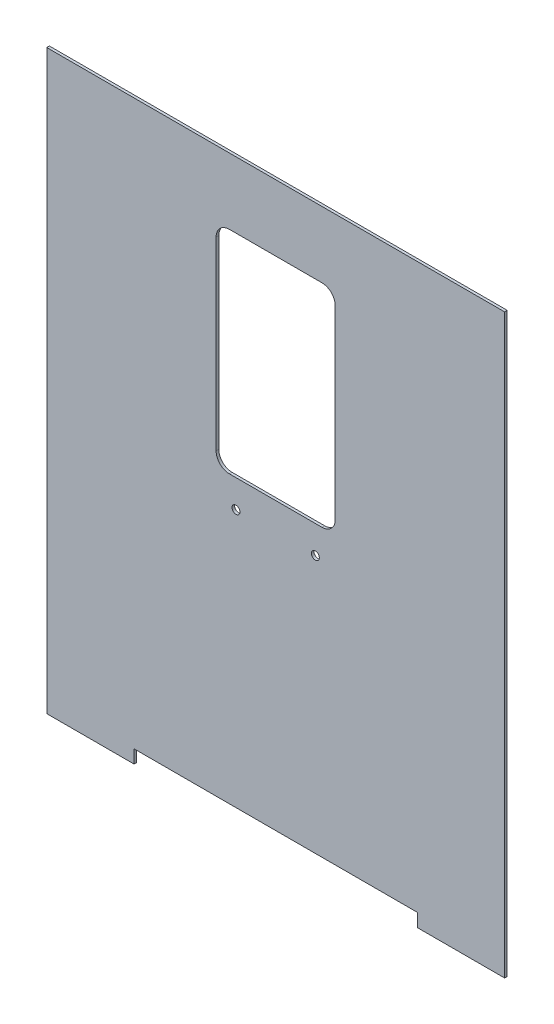
ISO-10303-21;
HEADER;
FILE_DESCRIPTION(('STEP AP214'),'2;1');
FILE_NAME('part.step','',(''),(''),'','','');
FILE_SCHEMA(('AUTOMOTIVE_DESIGN { 1 0 10303 214 1 1 1 1 }'));
ENDSEC;
DATA;
#1=APPLICATION_CONTEXT('core data for automotive mechanical design processes');
#2=APPLICATION_PROTOCOL_DEFINITION('international standard','automotive_design',2000,#1);
#3=PRODUCT_CONTEXT('',#1,'mechanical');
#4=PRODUCT('Part','Part','',(#3));
#5=PRODUCT_RELATED_PRODUCT_CATEGORY('part','',(#4));
#6=PRODUCT_DEFINITION_FORMATION('','',#4);
#7=PRODUCT_DEFINITION_CONTEXT('part definition',#1,'design');
#8=PRODUCT_DEFINITION('design','',#6,#7);
#9=PRODUCT_DEFINITION_SHAPE('','',#8);
#10=(LENGTH_UNIT() NAMED_UNIT(*) SI_UNIT(.MILLI.,.METRE.));
#11=(NAMED_UNIT(*) PLANE_ANGLE_UNIT() SI_UNIT($,.RADIAN.));
#12=(NAMED_UNIT(*) SI_UNIT($,.STERADIAN.) SOLID_ANGLE_UNIT());
#13=UNCERTAINTY_MEASURE_WITH_UNIT(LENGTH_MEASURE(1.E-05),#10,'distance_accuracy_value','');
#14=(GEOMETRIC_REPRESENTATION_CONTEXT(3) GLOBAL_UNCERTAINTY_ASSIGNED_CONTEXT((#13)) GLOBAL_UNIT_ASSIGNED_CONTEXT((#10,
#11,#12)) REPRESENTATION_CONTEXT('',''));
#15=CARTESIAN_POINT('',(0.,0.,0.));
#16=DIRECTION('',(0.,0.,1.));
#17=DIRECTION('',(1.,0.,0.));
#18=AXIS2_PLACEMENT_3D('',#15,#16,#17);
#19=CARTESIAN_POINT('',(-86.5,218.,-1.));
#20=DIRECTION('',(-1.,0.,0.));
#21=DIRECTION('',(0.,-1.,0.));
#22=AXIS2_PLACEMENT_3D('',#19,#20,#21);
#23=PLANE('',#22);
#24=DIRECTION('',(0.,-1.,0.));
#25=VECTOR('',#24,1.);
#26=CARTESIAN_POINT('',(-86.5,218.,0.));
#27=LINE('',#26,#25);
#28=CARTESIAN_POINT('',(-86.5,218.,0.));
#29=VERTEX_POINT('',#28);
#30=CARTESIAN_POINT('',(-86.5,0.,0.));
#31=VERTEX_POINT('',#30);
#32=EDGE_CURVE('E199',#29,#31,#27,.T.);
#33=ORIENTED_EDGE('',*,*,#32,.F.);
#34=DIRECTION('',(0.,0.,1.));
#35=VECTOR('',#34,1.);
#36=CARTESIAN_POINT('',(-86.5,218.,-1.));
#37=LINE('',#36,#35);
#38=CARTESIAN_POINT('',(-86.5,218.,-1.));
#39=VERTEX_POINT('',#38);
#40=EDGE_CURVE('E175',#39,#29,#37,.T.);
#41=ORIENTED_EDGE('',*,*,#40,.F.);
#42=DIRECTION('',(0.,-1.,0.));
#43=VECTOR('',#42,1.);
#44=CARTESIAN_POINT('',(-86.5,218.,-1.));
#45=LINE('',#44,#43);
#46=CARTESIAN_POINT('',(-86.5,0.,-1.));
#47=VERTEX_POINT('',#46);
#48=EDGE_CURVE('E169',#39,#47,#45,.T.);
#49=ORIENTED_EDGE('',*,*,#48,.T.);
#50=DIRECTION('',(0.,0.,1.));
#51=VECTOR('',#50,1.);
#52=CARTESIAN_POINT('',(-86.5,0.,-1.));
#53=LINE('',#52,#51);
#54=EDGE_CURVE('E151',#47,#31,#53,.T.);
#55=ORIENTED_EDGE('',*,*,#54,.T.);
#56=EDGE_LOOP('',(#33,#41,#49,#55));
#57=FACE_BOUND('',#56,.T.);
#58=ADVANCED_FACE('F38',(#57),#23,.T.);
#59=CARTESIAN_POINT('',(-86.5,218.,-1.));
#60=DIRECTION('',(0.,1.,0.));
#61=DIRECTION('',(0.,0.,1.));
#62=AXIS2_PLACEMENT_3D('',#59,#60,#61);
#63=PLANE('',#62);
#64=DIRECTION('',(-1.,0.,0.));
#65=VECTOR('',#64,1.);
#66=CARTESIAN_POINT('',(-86.5,218.,0.));
#67=LINE('',#66,#65);
#68=CARTESIAN_POINT('',(86.5,218.,0.));
#69=VERTEX_POINT('',#68);
#70=EDGE_CURVE('E176',#69,#29,#67,.T.);
#71=ORIENTED_EDGE('',*,*,#70,.F.);
#72=DIRECTION('',(0.,0.,1.));
#73=VECTOR('',#72,1.);
#74=CARTESIAN_POINT('',(86.5,218.,-1.));
#75=LINE('',#74,#73);
#76=CARTESIAN_POINT('',(86.5,218.,-1.));
#77=VERTEX_POINT('',#76);
#78=EDGE_CURVE('E219',#77,#69,#75,.T.);
#79=ORIENTED_EDGE('',*,*,#78,.F.);
#80=DIRECTION('',(-1.,0.,0.));
#81=VECTOR('',#80,1.);
#82=CARTESIAN_POINT('',(-86.5,218.,-1.));
#83=LINE('',#82,#81);
#84=EDGE_CURVE('E162',#77,#39,#83,.T.);
#85=ORIENTED_EDGE('',*,*,#84,.T.);
#86=ORIENTED_EDGE('',*,*,#40,.T.);
#87=EDGE_LOOP('',(#71,#79,#85,#86));
#88=FACE_BOUND('',#87,.T.);
#89=ADVANCED_FACE('F312',(#88),#63,.T.);
#90=CARTESIAN_POINT('',(86.5,218.,-1.));
#91=DIRECTION('',(1.,0.,0.));
#92=DIRECTION('',(0.,1.,0.));
#93=AXIS2_PLACEMENT_3D('',#90,#91,#92);
#94=PLANE('',#93);
#95=DIRECTION('',(0.,1.,0.));
#96=VECTOR('',#95,1.);
#97=CARTESIAN_POINT('',(86.5,218.,0.));
#98=LINE('',#97,#96);
#99=CARTESIAN_POINT('',(86.5,0.,0.));
#100=VERTEX_POINT('',#99);
#101=EDGE_CURVE('E179',#100,#69,#98,.T.);
#102=ORIENTED_EDGE('',*,*,#101,.F.);
#103=DIRECTION('',(0.,0.,1.));
#104=VECTOR('',#103,1.);
#105=CARTESIAN_POINT('',(86.5,0.,-1.));
#106=LINE('',#105,#104);
#107=CARTESIAN_POINT('',(86.5,0.,-1.));
#108=VERTEX_POINT('',#107);
#109=EDGE_CURVE('E221',#108,#100,#106,.T.);
#110=ORIENTED_EDGE('',*,*,#109,.F.);
#111=DIRECTION('',(0.,1.,0.));
#112=VECTOR('',#111,1.);
#113=CARTESIAN_POINT('',(86.5,218.,-1.));
#114=LINE('',#113,#112);
#115=EDGE_CURVE('E195',#108,#77,#114,.T.);
#116=ORIENTED_EDGE('',*,*,#115,.T.);
#117=ORIENTED_EDGE('',*,*,#78,.T.);
#118=EDGE_LOOP('',(#102,#110,#116,#117));
#119=FACE_BOUND('',#118,.T.);
#120=ADVANCED_FACE('F342',(#119),#94,.T.);
#121=CARTESIAN_POINT('',(53.5,0.,-1.));
#122=DIRECTION('',(0.,-1.,0.));
#123=DIRECTION('',(0.,0.,-1.));
#124=AXIS2_PLACEMENT_3D('',#121,#122,#123);
#125=PLANE('',#124);
#126=DIRECTION('',(1.,0.,0.));
#127=VECTOR('',#126,1.);
#128=CARTESIAN_POINT('',(53.5,0.,0.));
#129=LINE('',#128,#127);
#130=CARTESIAN_POINT('',(53.5,0.,0.));
#131=VERTEX_POINT('',#130);
#132=EDGE_CURVE('E212',#131,#100,#129,.T.);
#133=ORIENTED_EDGE('',*,*,#132,.F.);
#134=DIRECTION('',(0.,0.,1.));
#135=VECTOR('',#134,1.);
#136=CARTESIAN_POINT('',(53.5,0.,-1.));
#137=LINE('',#136,#135);
#138=CARTESIAN_POINT('',(53.5,0.,-1.));
#139=VERTEX_POINT('',#138);
#140=EDGE_CURVE('E223',#139,#131,#137,.T.);
#141=ORIENTED_EDGE('',*,*,#140,.F.);
#142=DIRECTION('',(1.,0.,0.));
#143=VECTOR('',#142,1.);
#144=CARTESIAN_POINT('',(53.5,0.,-1.));
#145=LINE('',#144,#143);
#146=EDGE_CURVE('E192',#139,#108,#145,.T.);
#147=ORIENTED_EDGE('',*,*,#146,.T.);
#148=ORIENTED_EDGE('',*,*,#109,.T.);
#149=EDGE_LOOP('',(#133,#141,#147,#148));
#150=FACE_BOUND('',#149,.T.);
#151=ADVANCED_FACE('F319',(#150),#125,.T.);
#152=CARTESIAN_POINT('',(53.5,0.,-1.));
#153=DIRECTION('',(-1.,0.,0.));
#154=DIRECTION('',(0.,0.,1.));
#155=AXIS2_PLACEMENT_3D('',#152,#153,#154);
#156=PLANE('',#155);
#157=DIRECTION('',(0.,-1.,0.));
#158=VECTOR('',#157,1.);
#159=CARTESIAN_POINT('',(53.5,0.,0.));
#160=LINE('',#159,#158);
#161=CARTESIAN_POINT('',(53.5,5.,0.));
#162=VERTEX_POINT('',#161);
#163=EDGE_CURVE('E209',#162,#131,#160,.T.);
#164=ORIENTED_EDGE('',*,*,#163,.F.);
#165=DIRECTION('',(0.,0.,1.));
#166=VECTOR('',#165,1.);
#167=CARTESIAN_POINT('',(53.5,5.,-1.));
#168=LINE('',#167,#166);
#169=CARTESIAN_POINT('',(53.5,5.,-1.));
#170=VERTEX_POINT('',#169);
#171=EDGE_CURVE('E225',#170,#162,#168,.T.);
#172=ORIENTED_EDGE('',*,*,#171,.F.);
#173=DIRECTION('',(0.,-1.,0.));
#174=VECTOR('',#173,1.);
#175=CARTESIAN_POINT('',(53.5,0.,-1.));
#176=LINE('',#175,#174);
#177=EDGE_CURVE('E189',#170,#139,#176,.T.);
#178=ORIENTED_EDGE('',*,*,#177,.T.);
#179=ORIENTED_EDGE('',*,*,#140,.T.);
#180=EDGE_LOOP('',(#164,#172,#178,#179));
#181=FACE_BOUND('',#180,.T.);
#182=ADVANCED_FACE('F322',(#181),#156,.T.);
#183=CARTESIAN_POINT('',(-53.5,5.,-1.));
#184=DIRECTION('',(0.,-1.,0.));
#185=DIRECTION('',(0.,0.,-1.));
#186=AXIS2_PLACEMENT_3D('',#183,#184,#185);
#187=PLANE('',#186);
#188=DIRECTION('',(1.,0.,0.));
#189=VECTOR('',#188,1.);
#190=CARTESIAN_POINT('',(-53.5,5.,0.));
#191=LINE('',#190,#189);
#192=CARTESIAN_POINT('',(-53.5,5.,0.));
#193=VERTEX_POINT('',#192);
#194=EDGE_CURVE('E206',#193,#162,#191,.T.);
#195=ORIENTED_EDGE('',*,*,#194,.F.);
#196=DIRECTION('',(0.,0.,1.));
#197=VECTOR('',#196,1.);
#198=CARTESIAN_POINT('',(-53.5,5.,-1.));
#199=LINE('',#198,#197);
#200=CARTESIAN_POINT('',(-53.5,5.,-1.));
#201=VERTEX_POINT('',#200);
#202=EDGE_CURVE('E227',#201,#193,#199,.T.);
#203=ORIENTED_EDGE('',*,*,#202,.F.);
#204=DIRECTION('',(1.,0.,0.));
#205=VECTOR('',#204,1.);
#206=CARTESIAN_POINT('',(-53.5,5.,-1.));
#207=LINE('',#206,#205);
#208=EDGE_CURVE('E186',#201,#170,#207,.T.);
#209=ORIENTED_EDGE('',*,*,#208,.T.);
#210=ORIENTED_EDGE('',*,*,#171,.T.);
#211=EDGE_LOOP('',(#195,#203,#209,#210));
#212=FACE_BOUND('',#211,.T.);
#213=ADVANCED_FACE('F325',(#212),#187,.T.);
#214=CARTESIAN_POINT('',(-53.5,0.,-1.));
#215=DIRECTION('',(1.,0.,0.));
#216=DIRECTION('',(0.,0.,-1.));
#217=AXIS2_PLACEMENT_3D('',#214,#215,#216);
#218=PLANE('',#217);
#219=DIRECTION('',(0.,1.,0.));
#220=VECTOR('',#219,1.);
#221=CARTESIAN_POINT('',(-53.5,0.,0.));
#222=LINE('',#221,#220);
#223=CARTESIAN_POINT('',(-53.5,0.,0.));
#224=VERTEX_POINT('',#223);
#225=EDGE_CURVE('E203',#224,#193,#222,.T.);
#226=ORIENTED_EDGE('',*,*,#225,.F.);
#227=DIRECTION('',(0.,0.,1.));
#228=VECTOR('',#227,1.);
#229=CARTESIAN_POINT('',(-53.5,0.,-1.));
#230=LINE('',#229,#228);
#231=CARTESIAN_POINT('',(-53.5,0.,-1.));
#232=VERTEX_POINT('',#231);
#233=EDGE_CURVE('E161',#232,#224,#230,.T.);
#234=ORIENTED_EDGE('',*,*,#233,.F.);
#235=DIRECTION('',(0.,1.,0.));
#236=VECTOR('',#235,1.);
#237=CARTESIAN_POINT('',(-53.5,0.,-1.));
#238=LINE('',#237,#236);
#239=EDGE_CURVE('E173',#232,#201,#238,.T.);
#240=ORIENTED_EDGE('',*,*,#239,.T.);
#241=ORIENTED_EDGE('',*,*,#202,.T.);
#242=EDGE_LOOP('',(#226,#234,#240,#241));
#243=FACE_BOUND('',#242,.T.);
#244=ADVANCED_FACE('F328',(#243),#218,.T.);
#245=CARTESIAN_POINT('',(-86.5,0.,-1.));
#246=DIRECTION('',(0.,-1.,0.));
#247=DIRECTION('',(0.,0.,-1.));
#248=AXIS2_PLACEMENT_3D('',#245,#246,#247);
#249=PLANE('',#248);
#250=DIRECTION('',(1.,0.,0.));
#251=VECTOR('',#250,1.);
#252=CARTESIAN_POINT('',(-86.5,0.,0.));
#253=LINE('',#252,#251);
#254=EDGE_CURVE('E156',#31,#224,#253,.T.);
#255=ORIENTED_EDGE('',*,*,#254,.F.);
#256=ORIENTED_EDGE('',*,*,#54,.F.);
#257=DIRECTION('',(1.,0.,0.));
#258=VECTOR('',#257,1.);
#259=CARTESIAN_POINT('',(-86.5,0.,-1.));
#260=LINE('',#259,#258);
#261=EDGE_CURVE('E154',#47,#232,#260,.T.);
#262=ORIENTED_EDGE('',*,*,#261,.T.);
#263=ORIENTED_EDGE('',*,*,#233,.T.);
#264=EDGE_LOOP('',(#255,#256,#262,#263));
#265=FACE_BOUND('',#264,.T.);
#266=ADVANCED_FACE('F153',(#265),#249,.T.);
#267=CARTESIAN_POINT('',(0.,0.,-1.));
#268=DIRECTION('',(0.,0.,1.));
#269=DIRECTION('',(1.,0.,0.));
#270=AXIS2_PLACEMENT_3D('',#267,#268,#269);
#271=PLANE('',#270);
#272=CARTESIAN_POINT('',(15.,102.5,-1.));
#273=DIRECTION('',(0.,0.,1.));
#274=DIRECTION('',(-1.,0.,0.));
#275=AXIS2_PLACEMENT_3D('',#272,#273,#274);
#276=CIRCLE('',#275,1.5);
#277=CARTESIAN_POINT('',(13.5,102.5,-1.));
#278=VERTEX_POINT('',#277);
#279=EDGE_CURVE('E294',#278,#278,#276,.T.);
#280=ORIENTED_EDGE('',*,*,#279,.T.);
#281=EDGE_LOOP('',(#280));
#282=FACE_BOUND('',#281,.T.);
#283=DIRECTION('',(0.,1.,0.));
#284=VECTOR('',#283,1.);
#285=CARTESIAN_POINT('',(22.5,193.,-1.));
#286=LINE('',#285,#284);
#287=CARTESIAN_POINT('',(22.5,118.,-1.));
#288=VERTEX_POINT('',#287);
#289=CARTESIAN_POINT('',(22.5,188.,-1.));
#290=VERTEX_POINT('',#289);
#291=EDGE_CURVE('E282',#288,#290,#286,.T.);
#292=ORIENTED_EDGE('',*,*,#291,.T.);
#293=CARTESIAN_POINT('',(17.5,188.,-1.));
#294=DIRECTION('',(0.,0.,1.));
#295=DIRECTION('',(1.,0.,0.));
#296=AXIS2_PLACEMENT_3D('',#293,#294,#295);
#297=CIRCLE('',#296,5.);
#298=CARTESIAN_POINT('',(17.5,193.,-1.));
#299=VERTEX_POINT('',#298);
#300=EDGE_CURVE('E250',#290,#299,#297,.T.);
#301=ORIENTED_EDGE('',*,*,#300,.T.);
#302=DIRECTION('',(-1.,0.,0.));
#303=VECTOR('',#302,1.);
#304=CARTESIAN_POINT('',(-22.5,193.,-1.));
#305=LINE('',#304,#303);
#306=CARTESIAN_POINT('',(-17.5,193.,-1.));
#307=VERTEX_POINT('',#306);
#308=EDGE_CURVE('E290',#299,#307,#305,.T.);
#309=ORIENTED_EDGE('',*,*,#308,.T.);
#310=CARTESIAN_POINT('',(-17.5,188.,-1.));
#311=DIRECTION('',(0.,0.,1.));
#312=DIRECTION('',(1.,0.,0.));
#313=AXIS2_PLACEMENT_3D('',#310,#311,#312);
#314=CIRCLE('',#313,5.);
#315=CARTESIAN_POINT('',(-22.5,188.,-1.));
#316=VERTEX_POINT('',#315);
#317=EDGE_CURVE('E11',#307,#316,#314,.T.);
#318=ORIENTED_EDGE('',*,*,#317,.T.);
#319=DIRECTION('',(0.,-1.,0.));
#320=VECTOR('',#319,1.);
#321=CARTESIAN_POINT('',(-22.5,193.,-1.));
#322=LINE('',#321,#320);
#323=CARTESIAN_POINT('',(-22.5,118.,-1.));
#324=VERTEX_POINT('',#323);
#325=EDGE_CURVE('E274',#316,#324,#322,.T.);
#326=ORIENTED_EDGE('',*,*,#325,.T.);
#327=CARTESIAN_POINT('',(-17.5,118.,-1.));
#328=DIRECTION('',(0.,0.,1.));
#329=DIRECTION('',(1.,0.,0.));
#330=AXIS2_PLACEMENT_3D('',#327,#328,#329);
#331=CIRCLE('',#330,5.);
#332=CARTESIAN_POINT('',(-17.5,113.,-1.));
#333=VERTEX_POINT('',#332);
#334=EDGE_CURVE('E258',#324,#333,#331,.T.);
#335=ORIENTED_EDGE('',*,*,#334,.T.);
#336=DIRECTION('',(1.,0.,0.));
#337=VECTOR('',#336,1.);
#338=CARTESIAN_POINT('',(-22.5,113.,-1.));
#339=LINE('',#338,#337);
#340=CARTESIAN_POINT('',(17.5,113.,-1.));
#341=VERTEX_POINT('',#340);
#342=EDGE_CURVE('E279',#333,#341,#339,.T.);
#343=ORIENTED_EDGE('',*,*,#342,.T.);
#344=CARTESIAN_POINT('',(17.5,118.,-1.));
#345=DIRECTION('',(0.,0.,1.));
#346=DIRECTION('',(1.,0.,0.));
#347=AXIS2_PLACEMENT_3D('',#344,#345,#346);
#348=CIRCLE('',#347,5.);
#349=EDGE_CURVE('E254',#341,#288,#348,.T.);
#350=ORIENTED_EDGE('',*,*,#349,.T.);
#351=EDGE_LOOP('',(#292,#301,#309,#318,#326,#335,#343,#350));
#352=FACE_BOUND('',#351,.T.);
#353=CARTESIAN_POINT('',(-15.,102.5,-1.));
#354=DIRECTION('',(0.,0.,1.));
#355=DIRECTION('',(1.,0.,0.));
#356=AXIS2_PLACEMENT_3D('',#353,#354,#355);
#357=CIRCLE('',#356,1.5);
#358=CARTESIAN_POINT('',(-13.5,102.5,-1.));
#359=VERTEX_POINT('',#358);
#360=EDGE_CURVE('E201',#359,#359,#357,.T.);
#361=ORIENTED_EDGE('',*,*,#360,.T.);
#362=EDGE_LOOP('',(#361));
#363=FACE_BOUND('',#362,.T.);
#364=ORIENTED_EDGE('',*,*,#48,.F.);
#365=ORIENTED_EDGE('',*,*,#84,.F.);
#366=ORIENTED_EDGE('',*,*,#115,.F.);
#367=ORIENTED_EDGE('',*,*,#146,.F.);
#368=ORIENTED_EDGE('',*,*,#177,.F.);
#369=ORIENTED_EDGE('',*,*,#208,.F.);
#370=ORIENTED_EDGE('',*,*,#239,.F.);
#371=ORIENTED_EDGE('',*,*,#261,.F.);
#372=EDGE_LOOP('',(#364,#365,#366,#367,#368,#369,#370,#371));
#373=FACE_BOUND('',#372,.T.);
#374=ADVANCED_FACE('F167',(#282,#352,#363,#373),#271,.F.);
#375=CARTESIAN_POINT('',(0.,0.,0.));
#376=DIRECTION('',(0.,0.,1.));
#377=DIRECTION('',(1.,0.,0.));
#378=AXIS2_PLACEMENT_3D('',#375,#376,#377);
#379=PLANE('',#378);
#380=CARTESIAN_POINT('',(15.,102.5,0.));
#381=DIRECTION('',(0.,0.,1.));
#382=DIRECTION('',(-1.,0.,0.));
#383=AXIS2_PLACEMENT_3D('',#380,#381,#382);
#384=CIRCLE('',#383,1.5);
#385=CARTESIAN_POINT('',(13.5,102.5,0.));
#386=VERTEX_POINT('',#385);
#387=EDGE_CURVE('E285',#386,#386,#384,.T.);
#388=ORIENTED_EDGE('',*,*,#387,.F.);
#389=EDGE_LOOP('',(#388));
#390=FACE_BOUND('',#389,.T.);
#391=DIRECTION('',(0.,-1.,0.));
#392=VECTOR('',#391,1.);
#393=CARTESIAN_POINT('',(-22.5,193.,0.));
#394=LINE('',#393,#392);
#395=CARTESIAN_POINT('',(-22.5,188.,0.));
#396=VERTEX_POINT('',#395);
#397=CARTESIAN_POINT('',(-22.5,118.,0.));
#398=VERTEX_POINT('',#397);
#399=EDGE_CURVE('E266',#396,#398,#394,.T.);
#400=ORIENTED_EDGE('',*,*,#399,.F.);
#401=CARTESIAN_POINT('',(-17.5,188.,0.));
#402=DIRECTION('',(0.,0.,1.));
#403=DIRECTION('',(1.,0.,0.));
#404=AXIS2_PLACEMENT_3D('',#401,#402,#403);
#405=CIRCLE('',#404,5.);
#406=CARTESIAN_POINT('',(-17.5,193.,0.));
#407=VERTEX_POINT('',#406);
#408=EDGE_CURVE('E46',#396,#407,#405,.F.);
#409=ORIENTED_EDGE('',*,*,#408,.T.);
#410=DIRECTION('',(-1.,0.,0.));
#411=VECTOR('',#410,1.);
#412=CARTESIAN_POINT('',(-22.5,193.,0.));
#413=LINE('',#412,#411);
#414=CARTESIAN_POINT('',(17.5,193.,0.));
#415=VERTEX_POINT('',#414);
#416=EDGE_CURVE('E265',#415,#407,#413,.T.);
#417=ORIENTED_EDGE('',*,*,#416,.F.);
#418=CARTESIAN_POINT('',(17.5,188.,0.));
#419=DIRECTION('',(0.,0.,1.));
#420=DIRECTION('',(1.,0.,0.));
#421=AXIS2_PLACEMENT_3D('',#418,#419,#420);
#422=CIRCLE('',#421,5.);
#423=CARTESIAN_POINT('',(22.5,188.,0.));
#424=VERTEX_POINT('',#423);
#425=EDGE_CURVE('E248',#415,#424,#422,.F.);
#426=ORIENTED_EDGE('',*,*,#425,.T.);
#427=DIRECTION('',(0.,1.,0.));
#428=VECTOR('',#427,1.);
#429=CARTESIAN_POINT('',(22.5,193.,0.));
#430=LINE('',#429,#428);
#431=CARTESIAN_POINT('',(22.5,118.,0.));
#432=VERTEX_POINT('',#431);
#433=EDGE_CURVE('E275',#432,#424,#430,.T.);
#434=ORIENTED_EDGE('',*,*,#433,.F.);
#435=CARTESIAN_POINT('',(17.5,118.,0.));
#436=DIRECTION('',(0.,0.,1.));
#437=DIRECTION('',(1.,0.,0.));
#438=AXIS2_PLACEMENT_3D('',#435,#436,#437);
#439=CIRCLE('',#438,5.);
#440=CARTESIAN_POINT('',(17.5,113.,0.));
#441=VERTEX_POINT('',#440);
#442=EDGE_CURVE('E252',#432,#441,#439,.F.);
#443=ORIENTED_EDGE('',*,*,#442,.T.);
#444=DIRECTION('',(1.,0.,0.));
#445=VECTOR('',#444,1.);
#446=CARTESIAN_POINT('',(-22.5,113.,0.));
#447=LINE('',#446,#445);
#448=CARTESIAN_POINT('',(-17.5,113.,0.));
#449=VERTEX_POINT('',#448);
#450=EDGE_CURVE('E293',#449,#441,#447,.T.);
#451=ORIENTED_EDGE('',*,*,#450,.F.);
#452=CARTESIAN_POINT('',(-17.5,118.,0.));
#453=DIRECTION('',(0.,0.,1.));
#454=DIRECTION('',(1.,0.,0.));
#455=AXIS2_PLACEMENT_3D('',#452,#453,#454);
#456=CIRCLE('',#455,5.);
#457=EDGE_CURVE('E256',#449,#398,#456,.F.);
#458=ORIENTED_EDGE('',*,*,#457,.T.);
#459=EDGE_LOOP('',(#400,#409,#417,#426,#434,#443,#451,#458));
#460=FACE_BOUND('',#459,.T.);
#461=CARTESIAN_POINT('',(-15.,102.5,0.));
#462=DIRECTION('',(0.,0.,1.));
#463=DIRECTION('',(1.,0.,0.));
#464=AXIS2_PLACEMENT_3D('',#461,#462,#463);
#465=CIRCLE('',#464,1.5);
#466=CARTESIAN_POINT('',(-13.5,102.5,0.));
#467=VERTEX_POINT('',#466);
#468=EDGE_CURVE('E182',#467,#467,#465,.T.);
#469=ORIENTED_EDGE('',*,*,#468,.F.);
#470=EDGE_LOOP('',(#469));
#471=FACE_BOUND('',#470,.T.);
#472=ORIENTED_EDGE('',*,*,#32,.T.);
#473=ORIENTED_EDGE('',*,*,#254,.T.);
#474=ORIENTED_EDGE('',*,*,#225,.T.);
#475=ORIENTED_EDGE('',*,*,#194,.T.);
#476=ORIENTED_EDGE('',*,*,#163,.T.);
#477=ORIENTED_EDGE('',*,*,#132,.T.);
#478=ORIENTED_EDGE('',*,*,#101,.T.);
#479=ORIENTED_EDGE('',*,*,#70,.T.);
#480=EDGE_LOOP('',(#472,#473,#474,#475,#476,#477,#478,#479));
#481=FACE_BOUND('',#480,.T.);
#482=ADVANCED_FACE('F263',(#390,#460,#471,#481),#379,.T.);
#483=CARTESIAN_POINT('',(-15.,102.5,-1.));
#484=DIRECTION('',(0.,0.,1.));
#485=DIRECTION('',(1.,0.,0.));
#486=AXIS2_PLACEMENT_3D('',#483,#484,#485);
#487=CYLINDRICAL_SURFACE('',#486,1.5);
#488=ORIENTED_EDGE('',*,*,#360,.F.);
#489=EDGE_LOOP('',(#488));
#490=FACE_BOUND('',#489,.T.);
#491=ORIENTED_EDGE('',*,*,#468,.T.);
#492=EDGE_LOOP('',(#491));
#493=FACE_BOUND('',#492,.T.);
#494=ADVANCED_FACE('F304',(#490,#493),#487,.F.);
#495=CARTESIAN_POINT('',(-22.5,193.,-1.));
#496=DIRECTION('',(-1.,0.,0.));
#497=DIRECTION('',(0.,-1.,0.));
#498=AXIS2_PLACEMENT_3D('',#495,#496,#497);
#499=PLANE('',#498);
#500=ORIENTED_EDGE('',*,*,#399,.T.);
#501=DIRECTION('',(0.,0.,1.));
#502=VECTOR('',#501,1.);
#503=CARTESIAN_POINT('',(-22.5,118.,-1.));
#504=LINE('',#503,#502);
#505=EDGE_CURVE('E53',#398,#324,#504,.F.);
#506=ORIENTED_EDGE('',*,*,#505,.T.);
#507=ORIENTED_EDGE('',*,*,#325,.F.);
#508=DIRECTION('',(0.,0.,1.));
#509=VECTOR('',#508,1.);
#510=CARTESIAN_POINT('',(-22.5,188.,0.));
#511=LINE('',#510,#509);
#512=EDGE_CURVE('E244',#316,#396,#511,.T.);
#513=ORIENTED_EDGE('',*,*,#512,.T.);
#514=EDGE_LOOP('',(#500,#506,#507,#513));
#515=FACE_BOUND('',#514,.T.);
#516=ADVANCED_FACE('F277',(#515),#499,.F.);
#517=CARTESIAN_POINT('',(-22.5,193.,-1.));
#518=DIRECTION('',(0.,1.,0.));
#519=DIRECTION('',(0.,0.,1.));
#520=AXIS2_PLACEMENT_3D('',#517,#518,#519);
#521=PLANE('',#520);
#522=ORIENTED_EDGE('',*,*,#308,.F.);
#523=DIRECTION('',(0.,0.,1.));
#524=VECTOR('',#523,1.);
#525=CARTESIAN_POINT('',(17.5,193.,0.));
#526=LINE('',#525,#524);
#527=EDGE_CURVE('E231',#299,#415,#526,.T.);
#528=ORIENTED_EDGE('',*,*,#527,.T.);
#529=ORIENTED_EDGE('',*,*,#416,.T.);
#530=DIRECTION('',(0.,0.,1.));
#531=VECTOR('',#530,1.);
#532=CARTESIAN_POINT('',(-17.5,193.,-1.));
#533=LINE('',#532,#531);
#534=EDGE_CURVE('E218',#407,#307,#533,.F.);
#535=ORIENTED_EDGE('',*,*,#534,.T.);
#536=EDGE_LOOP('',(#522,#528,#529,#535));
#537=FACE_BOUND('',#536,.T.);
#538=ADVANCED_FACE('F272',(#537),#521,.F.);
#539=CARTESIAN_POINT('',(22.5,193.,-1.));
#540=DIRECTION('',(1.,0.,0.));
#541=DIRECTION('',(0.,1.,0.));
#542=AXIS2_PLACEMENT_3D('',#539,#540,#541);
#543=PLANE('',#542);
#544=ORIENTED_EDGE('',*,*,#433,.T.);
#545=DIRECTION('',(0.,0.,1.));
#546=VECTOR('',#545,1.);
#547=CARTESIAN_POINT('',(22.5,188.,-1.));
#548=LINE('',#547,#546);
#549=EDGE_CURVE('E237',#424,#290,#548,.F.);
#550=ORIENTED_EDGE('',*,*,#549,.T.);
#551=ORIENTED_EDGE('',*,*,#291,.F.);
#552=DIRECTION('',(0.,0.,1.));
#553=VECTOR('',#552,1.);
#554=CARTESIAN_POINT('',(22.5,118.,0.));
#555=LINE('',#554,#553);
#556=EDGE_CURVE('E234',#288,#432,#555,.T.);
#557=ORIENTED_EDGE('',*,*,#556,.T.);
#558=EDGE_LOOP('',(#544,#550,#551,#557));
#559=FACE_BOUND('',#558,.T.);
#560=ADVANCED_FACE('F370',(#559),#543,.F.);
#561=CARTESIAN_POINT('',(-22.5,113.,-1.));
#562=DIRECTION('',(0.,-1.,0.));
#563=DIRECTION('',(0.,0.,-1.));
#564=AXIS2_PLACEMENT_3D('',#561,#562,#563);
#565=PLANE('',#564);
#566=ORIENTED_EDGE('',*,*,#450,.T.);
#567=DIRECTION('',(0.,0.,1.));
#568=VECTOR('',#567,1.);
#569=CARTESIAN_POINT('',(17.5,113.,-1.));
#570=LINE('',#569,#568);
#571=EDGE_CURVE('E242',#441,#341,#570,.F.);
#572=ORIENTED_EDGE('',*,*,#571,.T.);
#573=ORIENTED_EDGE('',*,*,#342,.F.);
#574=DIRECTION('',(0.,0.,1.));
#575=VECTOR('',#574,1.);
#576=CARTESIAN_POINT('',(-17.5,113.,0.));
#577=LINE('',#576,#575);
#578=EDGE_CURVE('E239',#333,#449,#577,.T.);
#579=ORIENTED_EDGE('',*,*,#578,.T.);
#580=EDGE_LOOP('',(#566,#572,#573,#579));
#581=FACE_BOUND('',#580,.T.);
#582=ADVANCED_FACE('F363',(#581),#565,.F.);
#583=CARTESIAN_POINT('',(15.,102.5,-1.));
#584=DIRECTION('',(0.,0.,1.));
#585=DIRECTION('',(1.,0.,0.));
#586=AXIS2_PLACEMENT_3D('',#583,#584,#585);
#587=CYLINDRICAL_SURFACE('',#586,1.5);
#588=ORIENTED_EDGE('',*,*,#279,.F.);
#589=EDGE_LOOP('',(#588));
#590=FACE_BOUND('',#589,.T.);
#591=ORIENTED_EDGE('',*,*,#387,.T.);
#592=EDGE_LOOP('',(#591));
#593=FACE_BOUND('',#592,.T.);
#594=ADVANCED_FACE('F349',(#590,#593),#587,.F.);
#595=CARTESIAN_POINT('',(17.5,188.,-1.));
#596=DIRECTION('',(0.,0.,-1.));
#597=DIRECTION('',(-1.,0.,0.));
#598=AXIS2_PLACEMENT_3D('',#595,#596,#597);
#599=CYLINDRICAL_SURFACE('',#598,5.);
#600=ORIENTED_EDGE('',*,*,#300,.F.);
#601=ORIENTED_EDGE('',*,*,#549,.F.);
#602=ORIENTED_EDGE('',*,*,#425,.F.);
#603=ORIENTED_EDGE('',*,*,#527,.F.);
#604=EDGE_LOOP('',(#600,#601,#602,#603));
#605=FACE_BOUND('',#604,.T.);
#606=ADVANCED_FACE('F345',(#605),#599,.F.);
#607=CARTESIAN_POINT('',(17.5,118.,-1.));
#608=DIRECTION('',(0.,0.,-1.));
#609=DIRECTION('',(-1.,0.,0.));
#610=AXIS2_PLACEMENT_3D('',#607,#608,#609);
#611=CYLINDRICAL_SURFACE('',#610,5.);
#612=ORIENTED_EDGE('',*,*,#349,.F.);
#613=ORIENTED_EDGE('',*,*,#571,.F.);
#614=ORIENTED_EDGE('',*,*,#442,.F.);
#615=ORIENTED_EDGE('',*,*,#556,.F.);
#616=EDGE_LOOP('',(#612,#613,#614,#615));
#617=FACE_BOUND('',#616,.T.);
#618=ADVANCED_FACE('F348',(#617),#611,.F.);
#619=CARTESIAN_POINT('',(-17.5,118.,-1.));
#620=DIRECTION('',(0.,0.,-1.));
#621=DIRECTION('',(-1.,0.,0.));
#622=AXIS2_PLACEMENT_3D('',#619,#620,#621);
#623=CYLINDRICAL_SURFACE('',#622,5.);
#624=ORIENTED_EDGE('',*,*,#334,.F.);
#625=ORIENTED_EDGE('',*,*,#505,.F.);
#626=ORIENTED_EDGE('',*,*,#457,.F.);
#627=ORIENTED_EDGE('',*,*,#578,.F.);
#628=EDGE_LOOP('',(#624,#625,#626,#627));
#629=FACE_BOUND('',#628,.T.);
#630=ADVANCED_FACE('F352',(#629),#623,.F.);
#631=CARTESIAN_POINT('',(-17.5,188.,-1.));
#632=DIRECTION('',(0.,0.,-1.));
#633=DIRECTION('',(-1.,0.,0.));
#634=AXIS2_PLACEMENT_3D('',#631,#632,#633);
#635=CYLINDRICAL_SURFACE('',#634,5.);
#636=ORIENTED_EDGE('',*,*,#317,.F.);
#637=ORIENTED_EDGE('',*,*,#534,.F.);
#638=ORIENTED_EDGE('',*,*,#408,.F.);
#639=ORIENTED_EDGE('',*,*,#512,.F.);
#640=EDGE_LOOP('',(#636,#637,#638,#639));
#641=FACE_BOUND('',#640,.T.);
#642=ADVANCED_FACE('F40',(#641),#635,.F.);
#643=CLOSED_SHELL('',(#58,#89,#120,#151,#182,#213,#244,#266,#374,#482,#494,#516,#538,#560,#582,
#594,#606,#618,#630,#642));
#644=MANIFOLD_SOLID_BREP('B2',#643);
#645=ADVANCED_BREP_SHAPE_REPRESENTATION('',(#18,#644),#14);
#646=SHAPE_DEFINITION_REPRESENTATION(#9,#645);
ENDSEC;
END-ISO-10303-21;
